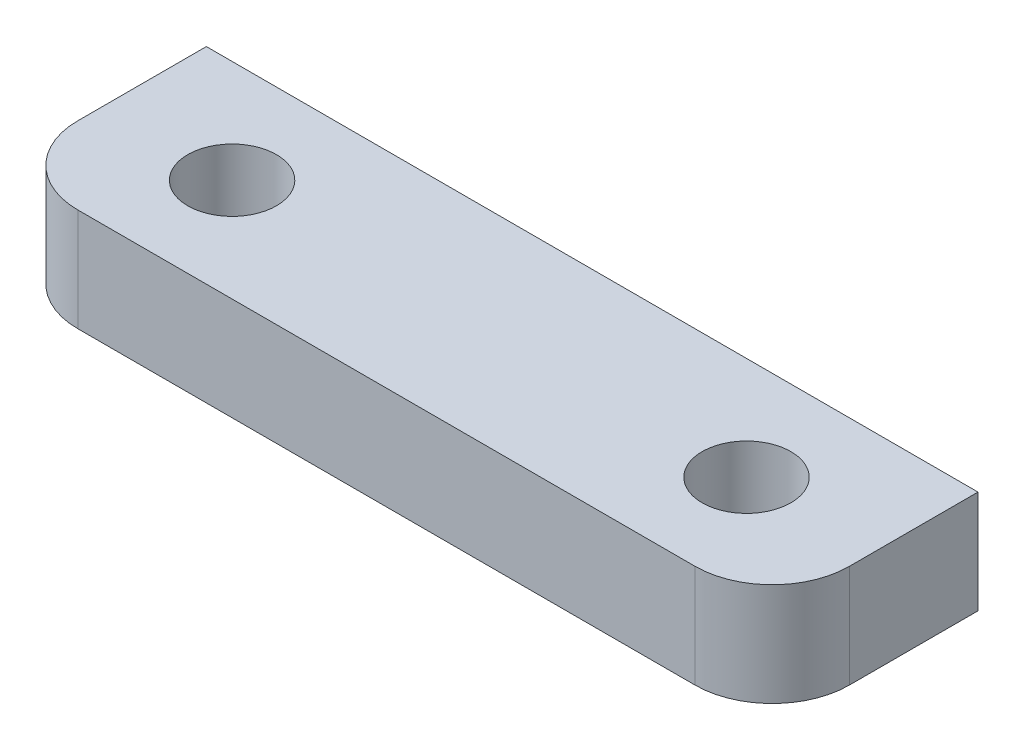
ISO-10303-21;
HEADER;
FILE_DESCRIPTION(('STEP AP214'),'2;1');
FILE_NAME('part.step','',(''),(''),'','','');
FILE_SCHEMA(('AUTOMOTIVE_DESIGN { 1 0 10303 214 1 1 1 1 }'));
ENDSEC;
DATA;
#1=APPLICATION_CONTEXT('core data for automotive mechanical design processes');
#2=APPLICATION_PROTOCOL_DEFINITION('international standard','automotive_design',2000,#1);
#3=PRODUCT_CONTEXT('',#1,'mechanical');
#4=PRODUCT('Part','Part','',(#3));
#5=PRODUCT_RELATED_PRODUCT_CATEGORY('part','',(#4));
#6=PRODUCT_DEFINITION_FORMATION('','',#4);
#7=PRODUCT_DEFINITION_CONTEXT('part definition',#1,'design');
#8=PRODUCT_DEFINITION('design','',#6,#7);
#9=PRODUCT_DEFINITION_SHAPE('','',#8);
#10=(LENGTH_UNIT() NAMED_UNIT(*) SI_UNIT(.MILLI.,.METRE.));
#11=(NAMED_UNIT(*) PLANE_ANGLE_UNIT() SI_UNIT($,.RADIAN.));
#12=(NAMED_UNIT(*) SI_UNIT($,.STERADIAN.) SOLID_ANGLE_UNIT());
#13=UNCERTAINTY_MEASURE_WITH_UNIT(LENGTH_MEASURE(1.E-05),#10,'distance_accuracy_value','');
#14=(GEOMETRIC_REPRESENTATION_CONTEXT(3) GLOBAL_UNCERTAINTY_ASSIGNED_CONTEXT((#13)) GLOBAL_UNIT_ASSIGNED_CONTEXT((#10,
#11,#12)) REPRESENTATION_CONTEXT('',''));
#15=CARTESIAN_POINT('',(0.,0.,0.));
#16=DIRECTION('',(0.,0.,1.));
#17=DIRECTION('',(1.,0.,0.));
#18=AXIS2_PLACEMENT_3D('',#15,#16,#17);
#19=CARTESIAN_POINT('',(0.,4.,0.));
#20=DIRECTION('',(0.,-1.,0.));
#21=DIRECTION('',(0.,0.,-1.));
#22=AXIS2_PLACEMENT_3D('',#19,#20,#21);
#23=PLANE('',#22);
#24=DIRECTION('',(1.,0.,0.));
#25=VECTOR('',#24,1.);
#26=CARTESIAN_POINT('',(-5.,4.,4.));
#27=LINE('',#26,#25);
#28=CARTESIAN_POINT('',(-2.,4.,4.));
#29=VERTEX_POINT('',#28);
#30=CARTESIAN_POINT('',(22.,4.,4.));
#31=VERTEX_POINT('',#30);
#32=EDGE_CURVE('E131',#29,#31,#27,.T.);
#33=ORIENTED_EDGE('',*,*,#32,.T.);
#34=CARTESIAN_POINT('',(22.,4.,0.999999999999999));
#35=DIRECTION('',(0.,-1.,0.));
#36=DIRECTION('',(0.,0.,-1.));
#37=AXIS2_PLACEMENT_3D('',#34,#35,#36);
#38=CIRCLE('',#37,3.);
#39=CARTESIAN_POINT('',(25.,4.,0.999999999999999));
#40=VERTEX_POINT('',#39);
#41=EDGE_CURVE('E52',#31,#40,#38,.F.);
#42=ORIENTED_EDGE('',*,*,#41,.T.);
#43=DIRECTION('',(0.,0.,-1.));
#44=VECTOR('',#43,1.);
#45=CARTESIAN_POINT('',(25.,4.,4.));
#46=LINE('',#45,#44);
#47=CARTESIAN_POINT('',(25.,4.,-4.));
#48=VERTEX_POINT('',#47);
#49=EDGE_CURVE('E98',#40,#48,#46,.T.);
#50=ORIENTED_EDGE('',*,*,#49,.T.);
#51=DIRECTION('',(-1.,0.,0.));
#52=VECTOR('',#51,1.);
#53=CARTESIAN_POINT('',(-5.,4.,-4.));
#54=LINE('',#53,#52);
#55=CARTESIAN_POINT('',(-5.,4.,-4.));
#56=VERTEX_POINT('',#55);
#57=EDGE_CURVE('E101',#48,#56,#54,.T.);
#58=ORIENTED_EDGE('',*,*,#57,.T.);
#59=DIRECTION('',(0.,0.,1.));
#60=VECTOR('',#59,1.);
#61=CARTESIAN_POINT('',(-5.,4.,4.));
#62=LINE('',#61,#60);
#63=CARTESIAN_POINT('',(-5.,4.,1.));
#64=VERTEX_POINT('',#63);
#65=EDGE_CURVE('E118',#56,#64,#62,.T.);
#66=ORIENTED_EDGE('',*,*,#65,.T.);
#67=CARTESIAN_POINT('',(-2.,4.,1.));
#68=DIRECTION('',(0.,-1.,0.));
#69=DIRECTION('',(0.,0.,-1.));
#70=AXIS2_PLACEMENT_3D('',#67,#68,#69);
#71=CIRCLE('',#70,3.);
#72=EDGE_CURVE('E146',#64,#29,#71,.F.);
#73=ORIENTED_EDGE('',*,*,#72,.T.);
#74=EDGE_LOOP('',(#33,#42,#50,#58,#66,#73));
#75=FACE_BOUND('',#74,.T.);
#76=CARTESIAN_POINT('',(0.,4.,0.));
#77=DIRECTION('',(0.,1.,0.));
#78=DIRECTION('',(0.,0.,1.));
#79=AXIS2_PLACEMENT_3D('',#76,#77,#78);
#80=CIRCLE('',#79,1.725);
#81=CARTESIAN_POINT('',(0.,4.,1.725));
#82=VERTEX_POINT('',#81);
#83=EDGE_CURVE('E170',#82,#82,#80,.T.);
#84=ORIENTED_EDGE('',*,*,#83,.F.);
#85=EDGE_LOOP('',(#84));
#86=FACE_BOUND('',#85,.T.);
#87=CARTESIAN_POINT('',(20.,4.,0.));
#88=DIRECTION('',(0.,1.,0.));
#89=DIRECTION('',(0.,0.,1.));
#90=AXIS2_PLACEMENT_3D('',#87,#88,#89);
#91=CIRCLE('',#90,1.725);
#92=CARTESIAN_POINT('',(20.,4.,1.725));
#93=VERTEX_POINT('',#92);
#94=EDGE_CURVE('E178',#93,#93,#91,.T.);
#95=ORIENTED_EDGE('',*,*,#94,.F.);
#96=EDGE_LOOP('',(#95));
#97=FACE_BOUND('',#96,.T.);
#98=ADVANCED_FACE('F43',(#75,#86,#97),#23,.F.);
#99=CARTESIAN_POINT('',(0.,0.,0.));
#100=DIRECTION('',(0.,-1.,0.));
#101=DIRECTION('',(0.,0.,-1.));
#102=AXIS2_PLACEMENT_3D('',#99,#100,#101);
#103=PLANE('',#102);
#104=CARTESIAN_POINT('',(0.,0.,0.));
#105=DIRECTION('',(0.,1.,0.));
#106=DIRECTION('',(0.,0.,1.));
#107=AXIS2_PLACEMENT_3D('',#104,#105,#106);
#108=CIRCLE('',#107,1.725);
#109=CARTESIAN_POINT('',(0.,0.,1.725));
#110=VERTEX_POINT('',#109);
#111=EDGE_CURVE('E174',#110,#110,#108,.T.);
#112=ORIENTED_EDGE('',*,*,#111,.T.);
#113=EDGE_LOOP('',(#112));
#114=FACE_BOUND('',#113,.T.);
#115=DIRECTION('',(0.,0.,-1.));
#116=VECTOR('',#115,1.);
#117=CARTESIAN_POINT('',(25.,0.,4.));
#118=LINE('',#117,#116);
#119=CARTESIAN_POINT('',(25.,0.,0.999999999999999));
#120=VERTEX_POINT('',#119);
#121=CARTESIAN_POINT('',(25.,0.,-4.));
#122=VERTEX_POINT('',#121);
#123=EDGE_CURVE('E122',#120,#122,#118,.T.);
#124=ORIENTED_EDGE('',*,*,#123,.F.);
#125=CARTESIAN_POINT('',(22.,0.,0.999999999999999));
#126=DIRECTION('',(0.,-1.,0.));
#127=DIRECTION('',(0.,0.,-1.));
#128=AXIS2_PLACEMENT_3D('',#125,#126,#127);
#129=CIRCLE('',#128,3.);
#130=CARTESIAN_POINT('',(22.,0.,4.));
#131=VERTEX_POINT('',#130);
#132=EDGE_CURVE('E137',#120,#131,#129,.T.);
#133=ORIENTED_EDGE('',*,*,#132,.T.);
#134=DIRECTION('',(1.,0.,0.));
#135=VECTOR('',#134,1.);
#136=CARTESIAN_POINT('',(-5.,0.,4.));
#137=LINE('',#136,#135);
#138=CARTESIAN_POINT('',(-2.,0.,4.));
#139=VERTEX_POINT('',#138);
#140=EDGE_CURVE('E109',#139,#131,#137,.T.);
#141=ORIENTED_EDGE('',*,*,#140,.F.);
#142=CARTESIAN_POINT('',(-2.,0.,1.));
#143=DIRECTION('',(0.,-1.,0.));
#144=DIRECTION('',(0.,0.,-1.));
#145=AXIS2_PLACEMENT_3D('',#142,#143,#144);
#146=CIRCLE('',#145,3.);
#147=CARTESIAN_POINT('',(-5.,0.,1.));
#148=VERTEX_POINT('',#147);
#149=EDGE_CURVE('E129',#139,#148,#146,.T.);
#150=ORIENTED_EDGE('',*,*,#149,.T.);
#151=DIRECTION('',(0.,0.,1.));
#152=VECTOR('',#151,1.);
#153=CARTESIAN_POINT('',(-5.,0.,4.));
#154=LINE('',#153,#152);
#155=CARTESIAN_POINT('',(-5.,0.,-4.));
#156=VERTEX_POINT('',#155);
#157=EDGE_CURVE('E160',#156,#148,#154,.T.);
#158=ORIENTED_EDGE('',*,*,#157,.F.);
#159=DIRECTION('',(-1.,0.,0.));
#160=VECTOR('',#159,1.);
#161=CARTESIAN_POINT('',(-5.,0.,-4.));
#162=LINE('',#161,#160);
#163=EDGE_CURVE('E163',#122,#156,#162,.T.);
#164=ORIENTED_EDGE('',*,*,#163,.F.);
#165=EDGE_LOOP('',(#124,#133,#141,#150,#158,#164));
#166=FACE_BOUND('',#165,.T.);
#167=CARTESIAN_POINT('',(20.,0.,0.));
#168=DIRECTION('',(0.,1.,0.));
#169=DIRECTION('',(0.,0.,1.));
#170=AXIS2_PLACEMENT_3D('',#167,#168,#169);
#171=CIRCLE('',#170,1.725);
#172=CARTESIAN_POINT('',(20.,0.,1.725));
#173=VERTEX_POINT('',#172);
#174=EDGE_CURVE('E182',#173,#173,#171,.T.);
#175=ORIENTED_EDGE('',*,*,#174,.T.);
#176=EDGE_LOOP('',(#175));
#177=FACE_BOUND('',#176,.T.);
#178=ADVANCED_FACE('F158',(#114,#166,#177),#103,.T.);
#179=CARTESIAN_POINT('',(25.,4.,4.));
#180=DIRECTION('',(-1.,0.,0.));
#181=DIRECTION('',(0.,0.,1.));
#182=AXIS2_PLACEMENT_3D('',#179,#180,#181);
#183=PLANE('',#182);
#184=ORIENTED_EDGE('',*,*,#49,.F.);
#185=DIRECTION('',(0.,-1.,0.));
#186=VECTOR('',#185,1.);
#187=CARTESIAN_POINT('',(25.,4.,0.999999999999999));
#188=LINE('',#187,#186);
#189=EDGE_CURVE('E125',#40,#120,#188,.T.);
#190=ORIENTED_EDGE('',*,*,#189,.T.);
#191=ORIENTED_EDGE('',*,*,#123,.T.);
#192=DIRECTION('',(0.,-1.,0.));
#193=VECTOR('',#192,1.);
#194=CARTESIAN_POINT('',(25.,4.,-4.));
#195=LINE('',#194,#193);
#196=EDGE_CURVE('E114',#48,#122,#195,.T.);
#197=ORIENTED_EDGE('',*,*,#196,.F.);
#198=EDGE_LOOP('',(#184,#190,#191,#197));
#199=FACE_BOUND('',#198,.T.);
#200=ADVANCED_FACE('F120',(#199),#183,.F.);
#201=CARTESIAN_POINT('',(-5.,4.,-4.));
#202=DIRECTION('',(0.,0.,1.));
#203=DIRECTION('',(1.,0.,0.));
#204=AXIS2_PLACEMENT_3D('',#201,#202,#203);
#205=PLANE('',#204);
#206=ORIENTED_EDGE('',*,*,#163,.T.);
#207=DIRECTION('',(0.,-1.,0.));
#208=VECTOR('',#207,1.);
#209=CARTESIAN_POINT('',(-5.,4.,-4.));
#210=LINE('',#209,#208);
#211=EDGE_CURVE('E116',#56,#156,#210,.T.);
#212=ORIENTED_EDGE('',*,*,#211,.F.);
#213=ORIENTED_EDGE('',*,*,#57,.F.);
#214=ORIENTED_EDGE('',*,*,#196,.T.);
#215=EDGE_LOOP('',(#206,#212,#213,#214));
#216=FACE_BOUND('',#215,.T.);
#217=ADVANCED_FACE('F113',(#216),#205,.F.);
#218=CARTESIAN_POINT('',(-5.,4.,4.));
#219=DIRECTION('',(1.,0.,0.));
#220=DIRECTION('',(0.,0.,-1.));
#221=AXIS2_PLACEMENT_3D('',#218,#219,#220);
#222=PLANE('',#221);
#223=ORIENTED_EDGE('',*,*,#157,.T.);
#224=DIRECTION('',(0.,-1.,0.));
#225=VECTOR('',#224,1.);
#226=CARTESIAN_POINT('',(-5.,4.,1.));
#227=LINE('',#226,#225);
#228=EDGE_CURVE('E11',#148,#64,#227,.F.);
#229=ORIENTED_EDGE('',*,*,#228,.T.);
#230=ORIENTED_EDGE('',*,*,#65,.F.);
#231=ORIENTED_EDGE('',*,*,#211,.T.);
#232=EDGE_LOOP('',(#223,#229,#230,#231));
#233=FACE_BOUND('',#232,.T.);
#234=ADVANCED_FACE('F161',(#233),#222,.F.);
#235=CARTESIAN_POINT('',(-5.,4.,4.));
#236=DIRECTION('',(0.,0.,-1.));
#237=DIRECTION('',(-1.,0.,0.));
#238=AXIS2_PLACEMENT_3D('',#235,#236,#237);
#239=PLANE('',#238);
#240=ORIENTED_EDGE('',*,*,#140,.T.);
#241=DIRECTION('',(0.,-1.,0.));
#242=VECTOR('',#241,1.);
#243=CARTESIAN_POINT('',(22.,4.,4.));
#244=LINE('',#243,#242);
#245=EDGE_CURVE('E65',#131,#31,#244,.F.);
#246=ORIENTED_EDGE('',*,*,#245,.T.);
#247=ORIENTED_EDGE('',*,*,#32,.F.);
#248=DIRECTION('',(0.,-1.,0.));
#249=VECTOR('',#248,1.);
#250=CARTESIAN_POINT('',(-2.,4.,4.));
#251=LINE('',#250,#249);
#252=EDGE_CURVE('E140',#29,#139,#251,.T.);
#253=ORIENTED_EDGE('',*,*,#252,.T.);
#254=EDGE_LOOP('',(#240,#246,#247,#253));
#255=FACE_BOUND('',#254,.T.);
#256=ADVANCED_FACE('F152',(#255),#239,.F.);
#257=CARTESIAN_POINT('',(0.,4.,0.));
#258=DIRECTION('',(0.,-1.,0.));
#259=DIRECTION('',(0.,0.,-1.));
#260=AXIS2_PLACEMENT_3D('',#257,#258,#259);
#261=CYLINDRICAL_SURFACE('',#260,1.725);
#262=ORIENTED_EDGE('',*,*,#83,.T.);
#263=EDGE_LOOP('',(#262));
#264=FACE_BOUND('',#263,.T.);
#265=ORIENTED_EDGE('',*,*,#111,.F.);
#266=EDGE_LOOP('',(#265));
#267=FACE_BOUND('',#266,.T.);
#268=ADVANCED_FACE('F201',(#264,#267),#261,.F.);
#269=CARTESIAN_POINT('',(20.,4.,0.));
#270=DIRECTION('',(0.,-1.,0.));
#271=DIRECTION('',(0.,0.,-1.));
#272=AXIS2_PLACEMENT_3D('',#269,#270,#271);
#273=CYLINDRICAL_SURFACE('',#272,1.725);
#274=ORIENTED_EDGE('',*,*,#94,.T.);
#275=EDGE_LOOP('',(#274));
#276=FACE_BOUND('',#275,.T.);
#277=ORIENTED_EDGE('',*,*,#174,.F.);
#278=EDGE_LOOP('',(#277));
#279=FACE_BOUND('',#278,.T.);
#280=ADVANCED_FACE('F190',(#276,#279),#273,.F.);
#281=CARTESIAN_POINT('',(22.,4.,0.999999999999999));
#282=DIRECTION('',(0.,-1.,0.));
#283=DIRECTION('',(0.,0.,-1.));
#284=AXIS2_PLACEMENT_3D('',#281,#282,#283);
#285=CYLINDRICAL_SURFACE('',#284,3.);
#286=ORIENTED_EDGE('',*,*,#41,.F.);
#287=ORIENTED_EDGE('',*,*,#245,.F.);
#288=ORIENTED_EDGE('',*,*,#132,.F.);
#289=ORIENTED_EDGE('',*,*,#189,.F.);
#290=EDGE_LOOP('',(#286,#287,#288,#289));
#291=FACE_BOUND('',#290,.T.);
#292=ADVANCED_FACE('F211',(#291),#285,.T.);
#293=CARTESIAN_POINT('',(-2.,4.,1.));
#294=DIRECTION('',(0.,-1.,0.));
#295=DIRECTION('',(0.,0.,-1.));
#296=AXIS2_PLACEMENT_3D('',#293,#294,#295);
#297=CYLINDRICAL_SURFACE('',#296,3.);
#298=ORIENTED_EDGE('',*,*,#72,.F.);
#299=ORIENTED_EDGE('',*,*,#228,.F.);
#300=ORIENTED_EDGE('',*,*,#149,.F.);
#301=ORIENTED_EDGE('',*,*,#252,.F.);
#302=EDGE_LOOP('',(#298,#299,#300,#301));
#303=FACE_BOUND('',#302,.T.);
#304=ADVANCED_FACE('F45',(#303),#297,.T.);
#305=CLOSED_SHELL('',(#98,#178,#200,#217,#234,#256,#268,#280,#292,#304));
#306=MANIFOLD_SOLID_BREP('B2',#305);
#307=ADVANCED_BREP_SHAPE_REPRESENTATION('',(#18,#306),#14);
#308=SHAPE_DEFINITION_REPRESENTATION(#9,#307);
ENDSEC;
END-ISO-10303-21;
